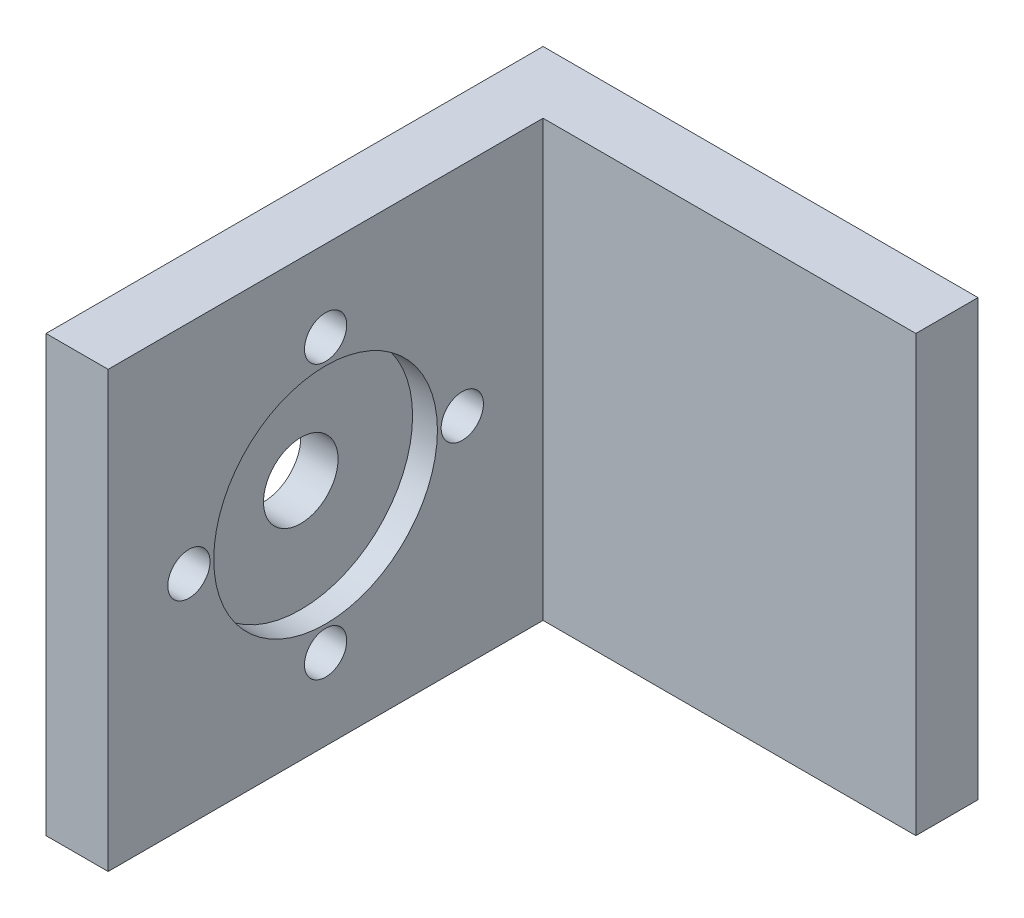
ISO-10303-21;
HEADER;
FILE_DESCRIPTION(('STEP AP214'),'2;1');
FILE_NAME('part.step','',(''),(''),'','','');
FILE_SCHEMA(('AUTOMOTIVE_DESIGN { 1 0 10303 214 1 1 1 1 }'));
ENDSEC;
DATA;
#1=APPLICATION_CONTEXT('core data for automotive mechanical design processes');
#2=APPLICATION_PROTOCOL_DEFINITION('international standard','automotive_design',2000,#1);
#3=PRODUCT_CONTEXT('',#1,'mechanical');
#4=PRODUCT('Part','Part','',(#3));
#5=PRODUCT_RELATED_PRODUCT_CATEGORY('part','',(#4));
#6=PRODUCT_DEFINITION_FORMATION('','',#4);
#7=PRODUCT_DEFINITION_CONTEXT('part definition',#1,'design');
#8=PRODUCT_DEFINITION('design','',#6,#7);
#9=PRODUCT_DEFINITION_SHAPE('','',#8);
#10=(LENGTH_UNIT() NAMED_UNIT(*) SI_UNIT(.MILLI.,.METRE.));
#11=(NAMED_UNIT(*) PLANE_ANGLE_UNIT() SI_UNIT($,.RADIAN.));
#12=(NAMED_UNIT(*) SI_UNIT($,.STERADIAN.) SOLID_ANGLE_UNIT());
#13=UNCERTAINTY_MEASURE_WITH_UNIT(LENGTH_MEASURE(1.E-05),#10,'distance_accuracy_value','');
#14=(GEOMETRIC_REPRESENTATION_CONTEXT(3) GLOBAL_UNCERTAINTY_ASSIGNED_CONTEXT((#13)) GLOBAL_UNIT_ASSIGNED_CONTEXT((#10,
#11,#12)) REPRESENTATION_CONTEXT('',''));
#15=CARTESIAN_POINT('',(0.,0.,0.));
#16=DIRECTION('',(0.,0.,1.));
#17=DIRECTION('',(1.,0.,0.));
#18=AXIS2_PLACEMENT_3D('',#15,#16,#17);
#19=CARTESIAN_POINT('',(5.,17.5,-17.5));
#20=DIRECTION('',(0.,-1.,0.));
#21=DIRECTION('',(0.,0.,-1.));
#22=AXIS2_PLACEMENT_3D('',#19,#20,#21);
#23=PLANE('',#22);
#24=DIRECTION('',(0.,0.,1.));
#25=VECTOR('',#24,1.);
#26=CARTESIAN_POINT('',(0.,17.5,-17.5));
#27=LINE('',#26,#25);
#28=CARTESIAN_POINT('',(0.,17.5,-22.5));
#29=VERTEX_POINT('',#28);
#30=CARTESIAN_POINT('',(0.,17.5,17.5));
#31=VERTEX_POINT('',#30);
#32=EDGE_CURVE('E111',#29,#31,#27,.T.);
#33=ORIENTED_EDGE('',*,*,#32,.T.);
#34=DIRECTION('',(-1.,0.,0.));
#35=VECTOR('',#34,1.);
#36=CARTESIAN_POINT('',(5.,17.5,17.5));
#37=LINE('',#36,#35);
#38=CARTESIAN_POINT('',(5.,17.5,17.5));
#39=VERTEX_POINT('',#38);
#40=EDGE_CURVE('E11',#39,#31,#37,.T.);
#41=ORIENTED_EDGE('',*,*,#40,.F.);
#42=DIRECTION('',(0.,0.,1.));
#43=VECTOR('',#42,1.);
#44=CARTESIAN_POINT('',(5.,17.5,-17.5));
#45=LINE('',#44,#43);
#46=CARTESIAN_POINT('',(5.,17.5,-17.5));
#47=VERTEX_POINT('',#46);
#48=EDGE_CURVE('E103',#47,#39,#45,.T.);
#49=ORIENTED_EDGE('',*,*,#48,.F.);
#50=DIRECTION('',(1.,0.,0.));
#51=VECTOR('',#50,1.);
#52=CARTESIAN_POINT('',(0.,17.5,-17.5));
#53=LINE('',#52,#51);
#54=CARTESIAN_POINT('',(35.,17.5,-17.5));
#55=VERTEX_POINT('',#54);
#56=EDGE_CURVE('E65',#47,#55,#53,.T.);
#57=ORIENTED_EDGE('',*,*,#56,.T.);
#58=DIRECTION('',(0.,0.,1.));
#59=VECTOR('',#58,1.);
#60=CARTESIAN_POINT('',(35.,17.5,-22.5));
#61=LINE('',#60,#59);
#62=CARTESIAN_POINT('',(35.,17.5,-22.5));
#63=VERTEX_POINT('',#62);
#64=EDGE_CURVE('E143',#63,#55,#61,.T.);
#65=ORIENTED_EDGE('',*,*,#64,.F.);
#66=DIRECTION('',(1.,0.,0.));
#67=VECTOR('',#66,1.);
#68=CARTESIAN_POINT('',(0.,17.5,-22.5));
#69=LINE('',#68,#67);
#70=EDGE_CURVE('E115',#29,#63,#69,.T.);
#71=ORIENTED_EDGE('',*,*,#70,.F.);
#72=EDGE_LOOP('',(#33,#41,#49,#57,#65,#71));
#73=FACE_BOUND('',#72,.T.);
#74=ADVANCED_FACE('F49',(#73),#23,.F.);
#75=CARTESIAN_POINT('',(5.,-17.5,17.5));
#76=DIRECTION('',(0.,0.,-1.));
#77=DIRECTION('',(-1.,0.,0.));
#78=AXIS2_PLACEMENT_3D('',#75,#76,#77);
#79=PLANE('',#78);
#80=DIRECTION('',(0.,-1.,0.));
#81=VECTOR('',#80,1.);
#82=CARTESIAN_POINT('',(0.,-17.5,17.5));
#83=LINE('',#82,#81);
#84=CARTESIAN_POINT('',(0.,-17.5,17.5));
#85=VERTEX_POINT('',#84);
#86=EDGE_CURVE('E78',#31,#85,#83,.T.);
#87=ORIENTED_EDGE('',*,*,#86,.T.);
#88=DIRECTION('',(-1.,0.,0.));
#89=VECTOR('',#88,1.);
#90=CARTESIAN_POINT('',(5.,-17.5,17.5));
#91=LINE('',#90,#89);
#92=CARTESIAN_POINT('',(5.,-17.5,17.5));
#93=VERTEX_POINT('',#92);
#94=EDGE_CURVE('E57',#93,#85,#91,.T.);
#95=ORIENTED_EDGE('',*,*,#94,.F.);
#96=DIRECTION('',(0.,-1.,0.));
#97=VECTOR('',#96,1.);
#98=CARTESIAN_POINT('',(5.,-17.5,17.5));
#99=LINE('',#98,#97);
#100=EDGE_CURVE('E93',#39,#93,#99,.T.);
#101=ORIENTED_EDGE('',*,*,#100,.F.);
#102=ORIENTED_EDGE('',*,*,#40,.T.);
#103=EDGE_LOOP('',(#87,#95,#101,#102));
#104=FACE_BOUND('',#103,.T.);
#105=ADVANCED_FACE('F95',(#104),#79,.F.);
#106=CARTESIAN_POINT('',(5.,-17.5,-17.5));
#107=DIRECTION('',(0.,1.,0.));
#108=DIRECTION('',(0.,0.,1.));
#109=AXIS2_PLACEMENT_3D('',#106,#107,#108);
#110=PLANE('',#109);
#111=DIRECTION('',(0.,0.,-1.));
#112=VECTOR('',#111,1.);
#113=CARTESIAN_POINT('',(0.,-17.5,-17.5));
#114=LINE('',#113,#112);
#115=CARTESIAN_POINT('',(0.,-17.5,-22.5));
#116=VERTEX_POINT('',#115);
#117=EDGE_CURVE('E108',#85,#116,#114,.T.);
#118=ORIENTED_EDGE('',*,*,#117,.T.);
#119=DIRECTION('',(-1.,0.,0.));
#120=VECTOR('',#119,1.);
#121=CARTESIAN_POINT('',(0.,-17.5,-22.5));
#122=LINE('',#121,#120);
#123=CARTESIAN_POINT('',(35.,-17.5,-22.5));
#124=VERTEX_POINT('',#123);
#125=EDGE_CURVE('E172',#124,#116,#122,.T.);
#126=ORIENTED_EDGE('',*,*,#125,.F.);
#127=DIRECTION('',(0.,0.,1.));
#128=VECTOR('',#127,1.);
#129=CARTESIAN_POINT('',(35.,-17.5,-22.5));
#130=LINE('',#129,#128);
#131=CARTESIAN_POINT('',(35.,-17.5,-17.5));
#132=VERTEX_POINT('',#131);
#133=EDGE_CURVE('E165',#124,#132,#130,.T.);
#134=ORIENTED_EDGE('',*,*,#133,.T.);
#135=DIRECTION('',(-1.,0.,0.));
#136=VECTOR('',#135,1.);
#137=CARTESIAN_POINT('',(0.,-17.5,-17.5));
#138=LINE('',#137,#136);
#139=CARTESIAN_POINT('',(5.,-17.5,-17.5));
#140=VERTEX_POINT('',#139);
#141=EDGE_CURVE('E174',#132,#140,#138,.T.);
#142=ORIENTED_EDGE('',*,*,#141,.T.);
#143=DIRECTION('',(0.,0.,-1.));
#144=VECTOR('',#143,1.);
#145=CARTESIAN_POINT('',(5.,-17.5,-17.5));
#146=LINE('',#145,#144);
#147=EDGE_CURVE('E102',#93,#140,#146,.T.);
#148=ORIENTED_EDGE('',*,*,#147,.F.);
#149=ORIENTED_EDGE('',*,*,#94,.T.);
#150=EDGE_LOOP('',(#118,#126,#134,#142,#148,#149));
#151=FACE_BOUND('',#150,.T.);
#152=ADVANCED_FACE('F188',(#151),#110,.F.);
#153=CARTESIAN_POINT('',(5.,0.,0.));
#154=DIRECTION('',(-1.,0.,0.));
#155=DIRECTION('',(0.,0.,1.));
#156=AXIS2_PLACEMENT_3D('',#153,#154,#155);
#157=PLANE('',#156);
#158=CARTESIAN_POINT('',(5.,-11.,0.));
#159=DIRECTION('',(1.,0.,0.));
#160=DIRECTION('',(0.,0.,-1.));
#161=AXIS2_PLACEMENT_3D('',#158,#159,#160);
#162=CIRCLE('',#161,1.7);
#163=CARTESIAN_POINT('',(5.,-11.,-1.7));
#164=VERTEX_POINT('',#163);
#165=EDGE_CURVE('E158',#164,#164,#162,.T.);
#166=ORIENTED_EDGE('',*,*,#165,.F.);
#167=EDGE_LOOP('',(#166));
#168=FACE_BOUND('',#167,.T.);
#169=CARTESIAN_POINT('',(5.,0.,-11.));
#170=DIRECTION('',(1.,0.,0.));
#171=DIRECTION('',(0.,0.,-1.));
#172=AXIS2_PLACEMENT_3D('',#169,#170,#171);
#173=CIRCLE('',#172,1.7);
#174=CARTESIAN_POINT('',(5.,0.,-12.7));
#175=VERTEX_POINT('',#174);
#176=EDGE_CURVE('E155',#175,#175,#173,.T.);
#177=ORIENTED_EDGE('',*,*,#176,.F.);
#178=EDGE_LOOP('',(#177));
#179=FACE_BOUND('',#178,.T.);
#180=CARTESIAN_POINT('',(5.,0.,11.));
#181=DIRECTION('',(1.,0.,0.));
#182=DIRECTION('',(0.,0.,-1.));
#183=AXIS2_PLACEMENT_3D('',#180,#181,#182);
#184=CIRCLE('',#183,1.7);
#185=CARTESIAN_POINT('',(5.,0.,9.3));
#186=VERTEX_POINT('',#185);
#187=EDGE_CURVE('E149',#186,#186,#184,.T.);
#188=ORIENTED_EDGE('',*,*,#187,.F.);
#189=EDGE_LOOP('',(#188));
#190=FACE_BOUND('',#189,.T.);
#191=CARTESIAN_POINT('',(5.,11.,0.));
#192=DIRECTION('',(1.,0.,0.));
#193=DIRECTION('',(0.,0.,-1.));
#194=AXIS2_PLACEMENT_3D('',#191,#192,#193);
#195=CIRCLE('',#194,1.7);
#196=CARTESIAN_POINT('',(5.,11.,-1.7));
#197=VERTEX_POINT('',#196);
#198=EDGE_CURVE('E142',#197,#197,#195,.T.);
#199=ORIENTED_EDGE('',*,*,#198,.F.);
#200=EDGE_LOOP('',(#199));
#201=FACE_BOUND('',#200,.T.);
#202=CARTESIAN_POINT('',(5.,0.,0.));
#203=DIRECTION('',(1.,0.,0.));
#204=DIRECTION('',(0.,0.,-1.));
#205=AXIS2_PLACEMENT_3D('',#202,#203,#204);
#206=CIRCLE('',#205,9.);
#207=CARTESIAN_POINT('',(5.,0.,-9.));
#208=VERTEX_POINT('',#207);
#209=EDGE_CURVE('E122',#208,#208,#206,.T.);
#210=ORIENTED_EDGE('',*,*,#209,.F.);
#211=EDGE_LOOP('',(#210));
#212=FACE_BOUND('',#211,.T.);
#213=ORIENTED_EDGE('',*,*,#48,.T.);
#214=ORIENTED_EDGE('',*,*,#100,.T.);
#215=ORIENTED_EDGE('',*,*,#147,.T.);
#216=DIRECTION('',(0.,1.,0.));
#217=VECTOR('',#216,1.);
#218=CARTESIAN_POINT('',(5.,-17.5,-17.5));
#219=LINE('',#218,#217);
#220=EDGE_CURVE('E82',#140,#47,#219,.T.);
#221=ORIENTED_EDGE('',*,*,#220,.T.);
#222=EDGE_LOOP('',(#213,#214,#215,#221));
#223=FACE_BOUND('',#222,.T.);
#224=ADVANCED_FACE('F106',(#168,#179,#190,#201,#212,#223),#157,.F.);
#225=CARTESIAN_POINT('',(0.,0.,0.));
#226=DIRECTION('',(-1.,0.,0.));
#227=DIRECTION('',(0.,0.,1.));
#228=AXIS2_PLACEMENT_3D('',#225,#226,#227);
#229=PLANE('',#228);
#230=CARTESIAN_POINT('',(0.,-11.,0.));
#231=DIRECTION('',(1.,0.,0.));
#232=DIRECTION('',(0.,0.,-1.));
#233=AXIS2_PLACEMENT_3D('',#230,#231,#232);
#234=CIRCLE('',#233,1.7);
#235=CARTESIAN_POINT('',(0.,-11.,-1.7));
#236=VERTEX_POINT('',#235);
#237=EDGE_CURVE('E136',#236,#236,#234,.T.);
#238=ORIENTED_EDGE('',*,*,#237,.T.);
#239=EDGE_LOOP('',(#238));
#240=FACE_BOUND('',#239,.T.);
#241=CARTESIAN_POINT('',(0.,0.,-11.));
#242=DIRECTION('',(1.,0.,0.));
#243=DIRECTION('',(0.,0.,-1.));
#244=AXIS2_PLACEMENT_3D('',#241,#242,#243);
#245=CIRCLE('',#244,1.7);
#246=CARTESIAN_POINT('',(0.,0.,-12.7));
#247=VERTEX_POINT('',#246);
#248=EDGE_CURVE('E152',#247,#247,#245,.T.);
#249=ORIENTED_EDGE('',*,*,#248,.T.);
#250=EDGE_LOOP('',(#249));
#251=FACE_BOUND('',#250,.T.);
#252=CARTESIAN_POINT('',(0.,0.,11.));
#253=DIRECTION('',(1.,0.,0.));
#254=DIRECTION('',(0.,0.,-1.));
#255=AXIS2_PLACEMENT_3D('',#252,#253,#254);
#256=CIRCLE('',#255,1.7);
#257=CARTESIAN_POINT('',(0.,0.,9.3));
#258=VERTEX_POINT('',#257);
#259=EDGE_CURVE('E146',#258,#258,#256,.T.);
#260=ORIENTED_EDGE('',*,*,#259,.T.);
#261=EDGE_LOOP('',(#260));
#262=FACE_BOUND('',#261,.T.);
#263=CARTESIAN_POINT('',(0.,11.,0.));
#264=DIRECTION('',(1.,0.,0.));
#265=DIRECTION('',(0.,0.,-1.));
#266=AXIS2_PLACEMENT_3D('',#263,#264,#265);
#267=CIRCLE('',#266,1.7);
#268=CARTESIAN_POINT('',(0.,11.,-1.7));
#269=VERTEX_POINT('',#268);
#270=EDGE_CURVE('E139',#269,#269,#267,.T.);
#271=ORIENTED_EDGE('',*,*,#270,.T.);
#272=EDGE_LOOP('',(#271));
#273=FACE_BOUND('',#272,.T.);
#274=CARTESIAN_POINT('',(0.,0.,0.));
#275=DIRECTION('',(1.,0.,0.));
#276=DIRECTION('',(0.,0.,-1.));
#277=AXIS2_PLACEMENT_3D('',#274,#275,#276);
#278=CIRCLE('',#277,3.);
#279=CARTESIAN_POINT('',(0.,0.,-3.));
#280=VERTEX_POINT('',#279);
#281=EDGE_CURVE('E131',#280,#280,#278,.T.);
#282=ORIENTED_EDGE('',*,*,#281,.T.);
#283=EDGE_LOOP('',(#282));
#284=FACE_BOUND('',#283,.T.);
#285=ORIENTED_EDGE('',*,*,#32,.F.);
#286=DIRECTION('',(0.,1.,0.));
#287=VECTOR('',#286,1.);
#288=CARTESIAN_POINT('',(0.,-17.5,-22.5));
#289=LINE('',#288,#287);
#290=EDGE_CURVE('E178',#116,#29,#289,.T.);
#291=ORIENTED_EDGE('',*,*,#290,.F.);
#292=ORIENTED_EDGE('',*,*,#117,.F.);
#293=ORIENTED_EDGE('',*,*,#86,.F.);
#294=EDGE_LOOP('',(#285,#291,#292,#293));
#295=FACE_BOUND('',#294,.T.);
#296=ADVANCED_FACE('F189',(#240,#251,#262,#273,#284,#295),#229,.T.);
#297=CARTESIAN_POINT('',(3.,0.,0.));
#298=DIRECTION('',(1.,0.,0.));
#299=DIRECTION('',(0.,0.,-1.));
#300=AXIS2_PLACEMENT_3D('',#297,#298,#299);
#301=CYLINDRICAL_SURFACE('',#300,9.);
#302=CARTESIAN_POINT('',(3.,0.,0.));
#303=DIRECTION('',(1.,0.,0.));
#304=DIRECTION('',(0.,0.,-1.));
#305=AXIS2_PLACEMENT_3D('',#302,#303,#304);
#306=CIRCLE('',#305,9.);
#307=CARTESIAN_POINT('',(3.,0.,-9.));
#308=VERTEX_POINT('',#307);
#309=EDGE_CURVE('E118',#308,#308,#306,.T.);
#310=ORIENTED_EDGE('',*,*,#309,.F.);
#311=EDGE_LOOP('',(#310));
#312=FACE_BOUND('',#311,.T.);
#313=ORIENTED_EDGE('',*,*,#209,.T.);
#314=EDGE_LOOP('',(#313));
#315=FACE_BOUND('',#314,.T.);
#316=ADVANCED_FACE('F191',(#312,#315),#301,.F.);
#317=CARTESIAN_POINT('',(3.,0.,0.));
#318=DIRECTION('',(1.,0.,0.));
#319=DIRECTION('',(0.,0.,-1.));
#320=AXIS2_PLACEMENT_3D('',#317,#318,#319);
#321=PLANE('',#320);
#322=CARTESIAN_POINT('',(3.,0.,0.));
#323=DIRECTION('',(1.,0.,0.));
#324=DIRECTION('',(0.,0.,-1.));
#325=AXIS2_PLACEMENT_3D('',#322,#323,#324);
#326=CIRCLE('',#325,3.);
#327=CARTESIAN_POINT('',(3.,0.,-3.));
#328=VERTEX_POINT('',#327);
#329=EDGE_CURVE('E133',#328,#328,#326,.T.);
#330=ORIENTED_EDGE('',*,*,#329,.F.);
#331=EDGE_LOOP('',(#330));
#332=FACE_BOUND('',#331,.T.);
#333=ORIENTED_EDGE('',*,*,#309,.T.);
#334=EDGE_LOOP('',(#333));
#335=FACE_BOUND('',#334,.T.);
#336=ADVANCED_FACE('F198',(#332,#335),#321,.T.);
#337=CARTESIAN_POINT('',(0.,0.,0.));
#338=DIRECTION('',(1.,0.,0.));
#339=DIRECTION('',(0.,0.,-1.));
#340=AXIS2_PLACEMENT_3D('',#337,#338,#339);
#341=CYLINDRICAL_SURFACE('',#340,3.);
#342=ORIENTED_EDGE('',*,*,#281,.F.);
#343=EDGE_LOOP('',(#342));
#344=FACE_BOUND('',#343,.T.);
#345=ORIENTED_EDGE('',*,*,#329,.T.);
#346=EDGE_LOOP('',(#345));
#347=FACE_BOUND('',#346,.T.);
#348=ADVANCED_FACE('F292',(#344,#347),#341,.F.);
#349=CARTESIAN_POINT('',(0.,11.,0.));
#350=DIRECTION('',(1.,0.,0.));
#351=DIRECTION('',(0.,0.,-1.));
#352=AXIS2_PLACEMENT_3D('',#349,#350,#351);
#353=CYLINDRICAL_SURFACE('',#352,1.7);
#354=ORIENTED_EDGE('',*,*,#270,.F.);
#355=EDGE_LOOP('',(#354));
#356=FACE_BOUND('',#355,.T.);
#357=ORIENTED_EDGE('',*,*,#198,.T.);
#358=EDGE_LOOP('',(#357));
#359=FACE_BOUND('',#358,.T.);
#360=ADVANCED_FACE('F283',(#356,#359),#353,.F.);
#361=CARTESIAN_POINT('',(0.,0.,11.));
#362=DIRECTION('',(1.,0.,0.));
#363=DIRECTION('',(0.,0.,-1.));
#364=AXIS2_PLACEMENT_3D('',#361,#362,#363);
#365=CYLINDRICAL_SURFACE('',#364,1.7);
#366=ORIENTED_EDGE('',*,*,#259,.F.);
#367=EDGE_LOOP('',(#366));
#368=FACE_BOUND('',#367,.T.);
#369=ORIENTED_EDGE('',*,*,#187,.T.);
#370=EDGE_LOOP('',(#369));
#371=FACE_BOUND('',#370,.T.);
#372=ADVANCED_FACE('F274',(#368,#371),#365,.F.);
#373=CARTESIAN_POINT('',(0.,0.,-11.));
#374=DIRECTION('',(1.,0.,0.));
#375=DIRECTION('',(0.,0.,-1.));
#376=AXIS2_PLACEMENT_3D('',#373,#374,#375);
#377=CYLINDRICAL_SURFACE('',#376,1.7);
#378=ORIENTED_EDGE('',*,*,#248,.F.);
#379=EDGE_LOOP('',(#378));
#380=FACE_BOUND('',#379,.T.);
#381=ORIENTED_EDGE('',*,*,#176,.T.);
#382=EDGE_LOOP('',(#381));
#383=FACE_BOUND('',#382,.T.);
#384=ADVANCED_FACE('F265',(#380,#383),#377,.F.);
#385=CARTESIAN_POINT('',(0.,-11.,0.));
#386=DIRECTION('',(1.,0.,0.));
#387=DIRECTION('',(0.,0.,-1.));
#388=AXIS2_PLACEMENT_3D('',#385,#386,#387);
#389=CYLINDRICAL_SURFACE('',#388,1.7);
#390=ORIENTED_EDGE('',*,*,#237,.F.);
#391=EDGE_LOOP('',(#390));
#392=FACE_BOUND('',#391,.T.);
#393=ORIENTED_EDGE('',*,*,#165,.T.);
#394=EDGE_LOOP('',(#393));
#395=FACE_BOUND('',#394,.T.);
#396=ADVANCED_FACE('F239',(#392,#395),#389,.F.);
#397=CARTESIAN_POINT('',(0.,0.,-17.5));
#398=DIRECTION('',(0.,0.,1.));
#399=DIRECTION('',(1.,0.,0.));
#400=AXIS2_PLACEMENT_3D('',#397,#398,#399);
#401=PLANE('',#400);
#402=ORIENTED_EDGE('',*,*,#220,.F.);
#403=ORIENTED_EDGE('',*,*,#141,.F.);
#404=DIRECTION('',(0.,-1.,0.));
#405=VECTOR('',#404,1.);
#406=CARTESIAN_POINT('',(35.,-17.5,-17.5));
#407=LINE('',#406,#405);
#408=EDGE_CURVE('E169',#55,#132,#407,.T.);
#409=ORIENTED_EDGE('',*,*,#408,.F.);
#410=ORIENTED_EDGE('',*,*,#56,.F.);
#411=EDGE_LOOP('',(#402,#403,#409,#410));
#412=FACE_BOUND('',#411,.T.);
#413=ADVANCED_FACE('F235',(#412),#401,.T.);
#414=CARTESIAN_POINT('',(35.,-17.5,-22.5));
#415=DIRECTION('',(-1.,0.,0.));
#416=DIRECTION('',(0.,0.,1.));
#417=AXIS2_PLACEMENT_3D('',#414,#415,#416);
#418=PLANE('',#417);
#419=ORIENTED_EDGE('',*,*,#408,.T.);
#420=ORIENTED_EDGE('',*,*,#133,.F.);
#421=DIRECTION('',(0.,-1.,0.));
#422=VECTOR('',#421,1.);
#423=CARTESIAN_POINT('',(35.,-17.5,-22.5));
#424=LINE('',#423,#422);
#425=EDGE_CURVE('E168',#63,#124,#424,.T.);
#426=ORIENTED_EDGE('',*,*,#425,.F.);
#427=ORIENTED_EDGE('',*,*,#64,.T.);
#428=EDGE_LOOP('',(#419,#420,#426,#427));
#429=FACE_BOUND('',#428,.T.);
#430=ADVANCED_FACE('F238',(#429),#418,.F.);
#431=CARTESIAN_POINT('',(0.,0.,-22.5));
#432=DIRECTION('',(0.,0.,1.));
#433=DIRECTION('',(1.,0.,0.));
#434=AXIS2_PLACEMENT_3D('',#431,#432,#433);
#435=PLANE('',#434);
#436=ORIENTED_EDGE('',*,*,#125,.T.);
#437=ORIENTED_EDGE('',*,*,#290,.T.);
#438=ORIENTED_EDGE('',*,*,#70,.T.);
#439=ORIENTED_EDGE('',*,*,#425,.T.);
#440=EDGE_LOOP('',(#436,#437,#438,#439));
#441=FACE_BOUND('',#440,.T.);
#442=ADVANCED_FACE('F184',(#441),#435,.F.);
#443=CLOSED_SHELL('',(#74,#105,#152,#224,#296,#316,#336,#348,#360,#372,#384,#396,#413,#430,#442));
#444=MANIFOLD_SOLID_BREP('B2',#443);
#445=ADVANCED_BREP_SHAPE_REPRESENTATION('',(#18,#444),#14);
#446=SHAPE_DEFINITION_REPRESENTATION(#9,#445);
ENDSEC;
END-ISO-10303-21;
